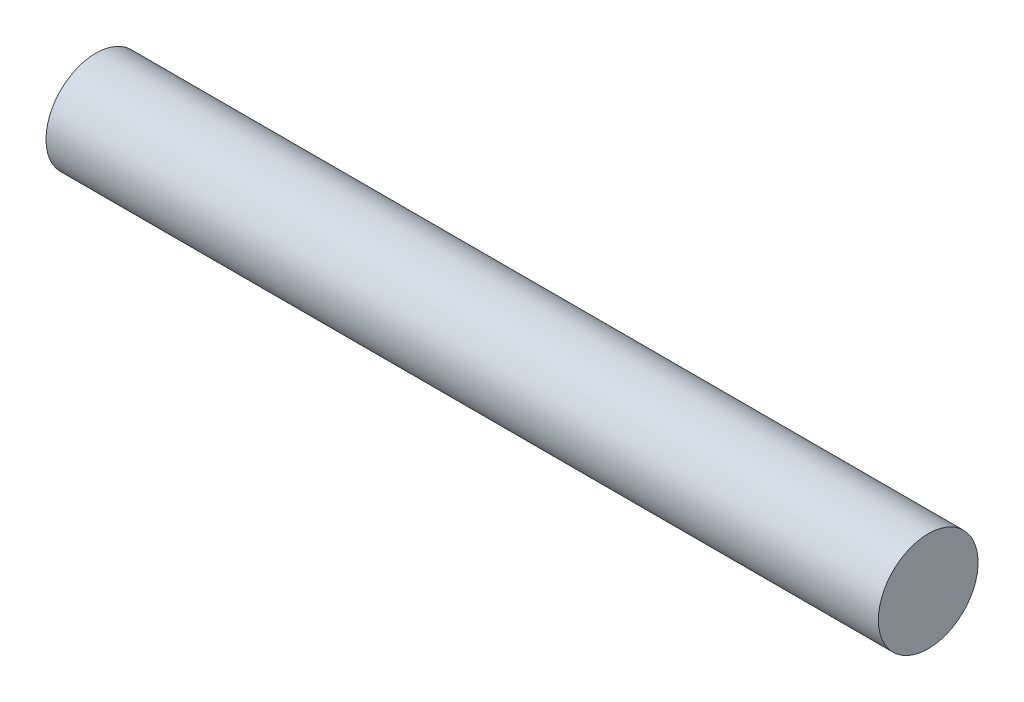
ISO-10303-21;
HEADER;
FILE_DESCRIPTION(('STEP AP214'),'2;1');
FILE_NAME('part.step','',(''),(''),'','','');
FILE_SCHEMA(('AUTOMOTIVE_DESIGN { 1 0 10303 214 1 1 1 1 }'));
ENDSEC;
DATA;
#1=APPLICATION_CONTEXT('core data for automotive mechanical design processes');
#2=APPLICATION_PROTOCOL_DEFINITION('international standard','automotive_design',2000,#1);
#3=PRODUCT_CONTEXT('',#1,'mechanical');
#4=PRODUCT('Part','Part','',(#3));
#5=PRODUCT_RELATED_PRODUCT_CATEGORY('part','',(#4));
#6=PRODUCT_DEFINITION_FORMATION('','',#4);
#7=PRODUCT_DEFINITION_CONTEXT('part definition',#1,'design');
#8=PRODUCT_DEFINITION('design','',#6,#7);
#9=PRODUCT_DEFINITION_SHAPE('','',#8);
#10=(LENGTH_UNIT() NAMED_UNIT(*) SI_UNIT(.MILLI.,.METRE.));
#11=(NAMED_UNIT(*) PLANE_ANGLE_UNIT() SI_UNIT($,.RADIAN.));
#12=(NAMED_UNIT(*) SI_UNIT($,.STERADIAN.) SOLID_ANGLE_UNIT());
#13=UNCERTAINTY_MEASURE_WITH_UNIT(LENGTH_MEASURE(1.E-05),#10,'distance_accuracy_value','');
#14=(GEOMETRIC_REPRESENTATION_CONTEXT(3) GLOBAL_UNCERTAINTY_ASSIGNED_CONTEXT((#13)) GLOBAL_UNIT_ASSIGNED_CONTEXT((#10,
#11,#12)) REPRESENTATION_CONTEXT('',''));
#15=CARTESIAN_POINT('',(0.,0.,0.));
#16=DIRECTION('',(0.,0.,1.));
#17=DIRECTION('',(1.,0.,0.));
#18=AXIS2_PLACEMENT_3D('',#15,#16,#17);
#19=CARTESIAN_POINT('',(45.2,0.,0.));
#20=DIRECTION('',(-1.,0.,0.));
#21=DIRECTION('',(0.,0.,1.));
#22=AXIS2_PLACEMENT_3D('',#19,#20,#21);
#23=CYLINDRICAL_SURFACE('',#22,4.);
#24=CARTESIAN_POINT('',(45.2,0.,0.));
#25=DIRECTION('',(1.,0.,0.));
#26=DIRECTION('',(0.,0.,-1.));
#27=AXIS2_PLACEMENT_3D('',#24,#25,#26);
#28=CIRCLE('',#27,4.);
#29=CARTESIAN_POINT('',(45.2,0.,4.));
#30=VERTEX_POINT('',#29);
#31=EDGE_CURVE('E10',#30,#30,#28,.T.);
#32=CARTESIAN_POINT('',(-21.59,0.,0.));
#33=DIRECTION('',(-1.,0.,0.));
#34=DIRECTION('',(0.,0.,1.));
#35=AXIS2_PLACEMENT_3D('',#32,#33,#34);
#36=CIRCLE('',#35,4.);
#37=CARTESIAN_POINT('',(-21.59,0.,4.));
#38=VERTEX_POINT('',#37);
#39=EDGE_CURVE('E36',#38,#38,#36,.T.);
#40=CARTESIAN_POINT('',(45.2,0.,4.));
#41=CARTESIAN_POINT('',(44.5042708333333,0.,4.));
#42=CARTESIAN_POINT('',(43.8085416666667,0.,4.));
#43=CARTESIAN_POINT('',(42.4170833333333,0.,4.));
#44=CARTESIAN_POINT('',(41.7213541666667,0.,4.));
#45=CARTESIAN_POINT('',(40.3298958333333,0.,4.));
#46=CARTESIAN_POINT('',(39.6341666666667,0.,4.));
#47=CARTESIAN_POINT('',(38.2427083333333,0.,4.));
#48=CARTESIAN_POINT('',(37.5469791666667,0.,4.));
#49=CARTESIAN_POINT('',(36.1555208333333,0.,4.));
#50=CARTESIAN_POINT('',(35.4597916666667,0.,4.));
#51=CARTESIAN_POINT('',(34.0683333333333,0.,4.));
#52=CARTESIAN_POINT('',(33.3726041666667,0.,4.));
#53=CARTESIAN_POINT('',(31.9811458333333,0.,4.));
#54=CARTESIAN_POINT('',(31.2854166666667,0.,4.));
#55=CARTESIAN_POINT('',(29.8939583333333,0.,4.));
#56=CARTESIAN_POINT('',(29.1982291666667,0.,4.));
#57=CARTESIAN_POINT('',(27.8067708333333,0.,4.));
#58=CARTESIAN_POINT('',(27.1110416666667,0.,4.));
#59=CARTESIAN_POINT('',(25.7195833333333,0.,4.));
#60=CARTESIAN_POINT('',(25.0238541666667,0.,4.));
#61=CARTESIAN_POINT('',(23.6323958333333,0.,4.));
#62=CARTESIAN_POINT('',(22.9366666666667,0.,4.));
#63=CARTESIAN_POINT('',(21.5452083333333,0.,4.));
#64=CARTESIAN_POINT('',(20.8494791666667,0.,4.));
#65=CARTESIAN_POINT('',(19.4580208333333,0.,4.));
#66=CARTESIAN_POINT('',(18.7622916666667,0.,4.));
#67=CARTESIAN_POINT('',(17.3708333333333,0.,4.));
#68=CARTESIAN_POINT('',(16.6751041666667,0.,4.));
#69=CARTESIAN_POINT('',(15.2836458333333,0.,4.));
#70=CARTESIAN_POINT('',(14.5879166666667,0.,4.));
#71=CARTESIAN_POINT('',(13.1964583333333,0.,4.));
#72=CARTESIAN_POINT('',(12.5007291666667,0.,4.));
#73=CARTESIAN_POINT('',(11.1092708333333,0.,4.));
#74=CARTESIAN_POINT('',(10.4135416666667,0.,4.));
#75=CARTESIAN_POINT('',(9.02208333333332,0.,4.));
#76=CARTESIAN_POINT('',(8.32635416666665,0.,4.));
#77=CARTESIAN_POINT('',(6.93489583333332,0.,4.));
#78=CARTESIAN_POINT('',(6.23916666666666,0.,4.));
#79=CARTESIAN_POINT('',(4.84770833333332,0.,4.));
#80=CARTESIAN_POINT('',(4.15197916666666,0.,4.));
#81=CARTESIAN_POINT('',(2.76052083333332,0.,4.));
#82=CARTESIAN_POINT('',(2.06479166666665,0.,4.));
#83=CARTESIAN_POINT('',(0.673333333333317,0.,4.));
#84=CARTESIAN_POINT('',(-0.0223958333333485,0.,4.));
#85=CARTESIAN_POINT('',(-1.41385416666668,0.,4.));
#86=CARTESIAN_POINT('',(-2.10958333333335,0.,4.));
#87=CARTESIAN_POINT('',(-3.50104166666668,0.,4.));
#88=CARTESIAN_POINT('',(-4.19677083333335,0.,4.));
#89=CARTESIAN_POINT('',(-5.58822916666668,0.,4.));
#90=CARTESIAN_POINT('',(-6.28395833333335,0.,4.));
#91=CARTESIAN_POINT('',(-7.67541666666668,0.,4.));
#92=CARTESIAN_POINT('',(-8.37114583333335,0.,4.));
#93=CARTESIAN_POINT('',(-9.76260416666668,0.,4.));
#94=CARTESIAN_POINT('',(-10.4583333333333,0.,4.));
#95=CARTESIAN_POINT('',(-11.8497916666667,0.,4.));
#96=CARTESIAN_POINT('',(-12.5455208333333,0.,4.));
#97=CARTESIAN_POINT('',(-13.9369791666667,0.,4.));
#98=CARTESIAN_POINT('',(-14.6327083333334,0.,4.));
#99=CARTESIAN_POINT('',(-16.0241666666667,0.,4.));
#100=CARTESIAN_POINT('',(-16.7198958333333,0.,4.));
#101=CARTESIAN_POINT('',(-18.1113541666667,0.,4.));
#102=CARTESIAN_POINT('',(-18.8070833333333,0.,4.));
#103=CARTESIAN_POINT('',(-20.1985416666667,0.,4.));
#104=CARTESIAN_POINT('',(-20.8942708333333,0.,4.));
#105=CARTESIAN_POINT('',(-21.59,0.,4.));
#106=B_SPLINE_CURVE_WITH_KNOTS('',3,(#40,#41,#42,#43,#44,#45,#46,#47,#48,#49,#50,#51,#52,#53,
#54,#55,#56,#57,#58,#59,#60,#61,#62,#63,#64,#65,#66,#67,#68,#69,#70,#71,#72,#73,#74,#75,#76,#77,
#78,#79,#80,#81,#82,#83,#84,#85,#86,#87,#88,#89,#90,#91,#92,#93,#94,#95,#96,#97,#98,#99,#100,
#101,#102,#103,#104,#105),.UNSPECIFIED.,.F.,.F.,(4,2,2,2,2,2,2,2,2,2,2,2,2,2,2,2,2,2,2,2,2,2,2,
2,2,2,2,2,2,2,2,2,4),(0.,2.0871875,4.17437499999999,6.2615625,8.34875,10.4359375,12.523125,
14.6103125,16.6975,18.7846875,20.871875,22.9590625,25.04625,27.1334375,29.220625,31.3078125,
33.395,35.4821875,37.569375,39.6565625,41.74375,43.8309375,45.918125,48.0053125,50.0925,
52.1796875,54.266875,56.3540625,58.44125,60.5284375,62.615625,64.7028125,66.79),.UNSPECIFIED.);
#107=EDGE_CURVE('BSEAM30',#30,#38,#106,.T.);
#108=ORIENTED_EDGE('',*,*,#31,.F.);
#109=ORIENTED_EDGE('',*,*,#39,.F.);
#110=ORIENTED_EDGE('',*,*,#107,.T.);
#111=ORIENTED_EDGE('',*,*,#107,.F.);
#112=EDGE_LOOP('',(#108,#110,#109,#111));
#113=FACE_BOUND('',#112,.T.);
#114=ADVANCED_FACE('F30',(#113),#23,.T.);
#115=CARTESIAN_POINT('',(45.2,0.,0.));
#116=DIRECTION('',(1.,0.,0.));
#117=DIRECTION('',(0.,0.,-1.));
#118=AXIS2_PLACEMENT_3D('',#115,#116,#117);
#119=PLANE('',#118);
#120=ORIENTED_EDGE('',*,*,#31,.T.);
#121=EDGE_LOOP('',(#120));
#122=FACE_BOUND('',#121,.T.);
#123=ADVANCED_FACE('F45',(#122),#119,.T.);
#124=CARTESIAN_POINT('',(-21.59,0.,0.));
#125=DIRECTION('',(-1.,0.,0.));
#126=DIRECTION('',(0.,0.,1.));
#127=AXIS2_PLACEMENT_3D('',#124,#125,#126);
#128=PLANE('',#127);
#129=ORIENTED_EDGE('',*,*,#39,.T.);
#130=EDGE_LOOP('',(#129));
#131=FACE_BOUND('',#130,.T.);
#132=ADVANCED_FACE('F42',(#131),#128,.T.);
#133=CLOSED_SHELL('',(#114,#123,#132));
#134=MANIFOLD_SOLID_BREP('B2',#133);
#135=ADVANCED_BREP_SHAPE_REPRESENTATION('',(#18,#134),#14);
#136=SHAPE_DEFINITION_REPRESENTATION(#9,#135);
ENDSEC;
END-ISO-10303-21;
